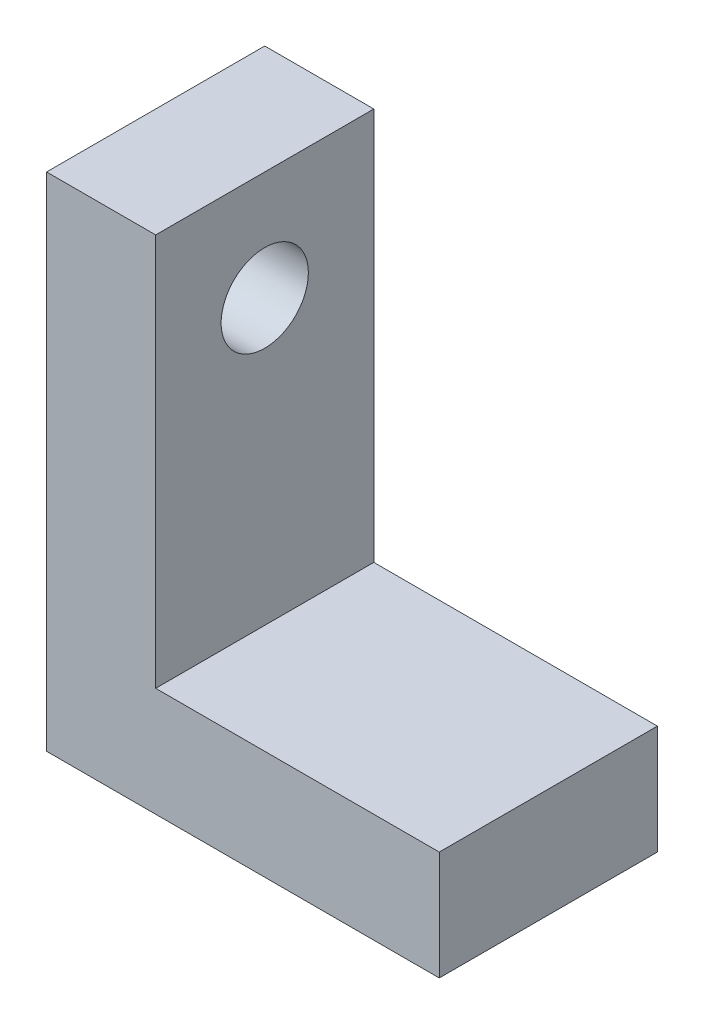
ISO-10303-21;
HEADER;
FILE_DESCRIPTION(('STEP AP214'),'2;1');
FILE_NAME('part.step','',(''),(''),'','','');
FILE_SCHEMA(('AUTOMOTIVE_DESIGN { 1 0 10303 214 1 1 1 1 }'));
ENDSEC;
DATA;
#1=APPLICATION_CONTEXT('core data for automotive mechanical design processes');
#2=APPLICATION_PROTOCOL_DEFINITION('international standard','automotive_design',2000,#1);
#3=PRODUCT_CONTEXT('',#1,'mechanical');
#4=PRODUCT('Part','Part','',(#3));
#5=PRODUCT_RELATED_PRODUCT_CATEGORY('part','',(#4));
#6=PRODUCT_DEFINITION_FORMATION('','',#4);
#7=PRODUCT_DEFINITION_CONTEXT('part definition',#1,'design');
#8=PRODUCT_DEFINITION('design','',#6,#7);
#9=PRODUCT_DEFINITION_SHAPE('','',#8);
#10=(LENGTH_UNIT() NAMED_UNIT(*) SI_UNIT(.MILLI.,.METRE.));
#11=(NAMED_UNIT(*) PLANE_ANGLE_UNIT() SI_UNIT($,.RADIAN.));
#12=(NAMED_UNIT(*) SI_UNIT($,.STERADIAN.) SOLID_ANGLE_UNIT());
#13=UNCERTAINTY_MEASURE_WITH_UNIT(LENGTH_MEASURE(1.E-05),#10,'distance_accuracy_value','');
#14=(GEOMETRIC_REPRESENTATION_CONTEXT(3) GLOBAL_UNCERTAINTY_ASSIGNED_CONTEXT((#13)) GLOBAL_UNIT_ASSIGNED_CONTEXT((#10,
#11,#12)) REPRESENTATION_CONTEXT('',''));
#15=CARTESIAN_POINT('',(0.,0.,0.));
#16=DIRECTION('',(0.,0.,1.));
#17=DIRECTION('',(1.,0.,0.));
#18=AXIS2_PLACEMENT_3D('',#15,#16,#17);
#19=CARTESIAN_POINT('',(18.,0.,5.));
#20=DIRECTION('',(0.,1.,0.));
#21=DIRECTION('',(-1.,0.,0.));
#22=AXIS2_PLACEMENT_3D('',#19,#20,#21);
#23=PLANE('',#22);
#24=DIRECTION('',(1.,0.,0.));
#25=VECTOR('',#24,1.);
#26=CARTESIAN_POINT('',(18.,0.,-5.));
#27=LINE('',#26,#25);
#28=CARTESIAN_POINT('',(0.,0.,-5.));
#29=VERTEX_POINT('',#28);
#30=CARTESIAN_POINT('',(18.,0.,-5.));
#31=VERTEX_POINT('',#30);
#32=EDGE_CURVE('E133',#29,#31,#27,.T.);
#33=ORIENTED_EDGE('',*,*,#32,.T.);
#34=DIRECTION('',(0.,0.,-1.));
#35=VECTOR('',#34,1.);
#36=CARTESIAN_POINT('',(18.,0.,5.));
#37=LINE('',#36,#35);
#38=CARTESIAN_POINT('',(18.,0.,5.));
#39=VERTEX_POINT('',#38);
#40=EDGE_CURVE('E11',#39,#31,#37,.T.);
#41=ORIENTED_EDGE('',*,*,#40,.F.);
#42=DIRECTION('',(1.,0.,0.));
#43=VECTOR('',#42,1.);
#44=CARTESIAN_POINT('',(18.,0.,5.));
#45=LINE('',#44,#43);
#46=CARTESIAN_POINT('',(0.,0.,5.));
#47=VERTEX_POINT('',#46);
#48=EDGE_CURVE('E151',#47,#39,#45,.T.);
#49=ORIENTED_EDGE('',*,*,#48,.F.);
#50=DIRECTION('',(0.,0.,-1.));
#51=VECTOR('',#50,1.);
#52=CARTESIAN_POINT('',(0.,0.,5.));
#53=LINE('',#52,#51);
#54=EDGE_CURVE('E128',#47,#29,#53,.T.);
#55=ORIENTED_EDGE('',*,*,#54,.T.);
#56=EDGE_LOOP('',(#33,#41,#49,#55));
#57=FACE_BOUND('',#56,.T.);
#58=ADVANCED_FACE('F44',(#57),#23,.F.);
#59=CARTESIAN_POINT('',(18.,5.,5.));
#60=DIRECTION('',(-1.,0.,0.));
#61=DIRECTION('',(0.,0.,1.));
#62=AXIS2_PLACEMENT_3D('',#59,#60,#61);
#63=PLANE('',#62);
#64=DIRECTION('',(0.,1.,0.));
#65=VECTOR('',#64,1.);
#66=CARTESIAN_POINT('',(18.,5.,-5.));
#67=LINE('',#66,#65);
#68=CARTESIAN_POINT('',(18.,5.,-5.));
#69=VERTEX_POINT('',#68);
#70=EDGE_CURVE('E139',#31,#69,#67,.T.);
#71=ORIENTED_EDGE('',*,*,#70,.T.);
#72=DIRECTION('',(0.,0.,-1.));
#73=VECTOR('',#72,1.);
#74=CARTESIAN_POINT('',(18.,5.,5.));
#75=LINE('',#74,#73);
#76=CARTESIAN_POINT('',(18.,5.,5.));
#77=VERTEX_POINT('',#76);
#78=EDGE_CURVE('E53',#77,#69,#75,.T.);
#79=ORIENTED_EDGE('',*,*,#78,.F.);
#80=DIRECTION('',(0.,1.,0.));
#81=VECTOR('',#80,1.);
#82=CARTESIAN_POINT('',(18.,5.,5.));
#83=LINE('',#82,#81);
#84=EDGE_CURVE('E97',#39,#77,#83,.T.);
#85=ORIENTED_EDGE('',*,*,#84,.F.);
#86=ORIENTED_EDGE('',*,*,#40,.T.);
#87=EDGE_LOOP('',(#71,#79,#85,#86));
#88=FACE_BOUND('',#87,.T.);
#89=ADVANCED_FACE('F181',(#88),#63,.F.);
#90=CARTESIAN_POINT('',(5.,5.,5.));
#91=DIRECTION('',(0.,-1.,0.));
#92=DIRECTION('',(0.,0.,-1.));
#93=AXIS2_PLACEMENT_3D('',#90,#91,#92);
#94=PLANE('',#93);
#95=DIRECTION('',(-1.,0.,0.));
#96=VECTOR('',#95,1.);
#97=CARTESIAN_POINT('',(5.,5.,-5.));
#98=LINE('',#97,#96);
#99=CARTESIAN_POINT('',(5.,5.,-5.));
#100=VERTEX_POINT('',#99);
#101=EDGE_CURVE('E142',#69,#100,#98,.T.);
#102=ORIENTED_EDGE('',*,*,#101,.T.);
#103=DIRECTION('',(0.,0.,-1.));
#104=VECTOR('',#103,1.);
#105=CARTESIAN_POINT('',(5.,5.,5.));
#106=LINE('',#105,#104);
#107=CARTESIAN_POINT('',(5.,5.,5.));
#108=VERTEX_POINT('',#107);
#109=EDGE_CURVE('E124',#108,#100,#106,.T.);
#110=ORIENTED_EDGE('',*,*,#109,.F.);
#111=DIRECTION('',(-1.,0.,0.));
#112=VECTOR('',#111,1.);
#113=CARTESIAN_POINT('',(5.,5.,5.));
#114=LINE('',#113,#112);
#115=EDGE_CURVE('E115',#77,#108,#114,.T.);
#116=ORIENTED_EDGE('',*,*,#115,.F.);
#117=ORIENTED_EDGE('',*,*,#78,.T.);
#118=EDGE_LOOP('',(#102,#110,#116,#117));
#119=FACE_BOUND('',#118,.T.);
#120=ADVANCED_FACE('F161',(#119),#94,.F.);
#121=CARTESIAN_POINT('',(5.,23.,5.));
#122=DIRECTION('',(-1.,0.,0.));
#123=DIRECTION('',(0.,-1.,0.));
#124=AXIS2_PLACEMENT_3D('',#121,#122,#123);
#125=PLANE('',#124);
#126=CARTESIAN_POINT('',(5.,18.,0.));
#127=DIRECTION('',(1.,0.,0.));
#128=DIRECTION('',(0.,0.,-1.));
#129=AXIS2_PLACEMENT_3D('',#126,#127,#128);
#130=CIRCLE('',#129,2.);
#131=CARTESIAN_POINT('',(5.,18.,-2.));
#132=VERTEX_POINT('',#131);
#133=EDGE_CURVE('E196',#132,#132,#130,.T.);
#134=ORIENTED_EDGE('',*,*,#133,.F.);
#135=EDGE_LOOP('',(#134));
#136=FACE_BOUND('',#135,.T.);
#137=DIRECTION('',(0.,1.,0.));
#138=VECTOR('',#137,1.);
#139=CARTESIAN_POINT('',(5.,23.,-5.));
#140=LINE('',#139,#138);
#141=CARTESIAN_POINT('',(5.,23.,-5.));
#142=VERTEX_POINT('',#141);
#143=EDGE_CURVE('E121',#100,#142,#140,.T.);
#144=ORIENTED_EDGE('',*,*,#143,.T.);
#145=DIRECTION('',(0.,0.,-1.));
#146=VECTOR('',#145,1.);
#147=CARTESIAN_POINT('',(5.,23.,5.));
#148=LINE('',#147,#146);
#149=CARTESIAN_POINT('',(5.,23.,5.));
#150=VERTEX_POINT('',#149);
#151=EDGE_CURVE('E117',#150,#142,#148,.T.);
#152=ORIENTED_EDGE('',*,*,#151,.F.);
#153=DIRECTION('',(0.,1.,0.));
#154=VECTOR('',#153,1.);
#155=CARTESIAN_POINT('',(5.,23.,5.));
#156=LINE('',#155,#154);
#157=EDGE_CURVE('E106',#108,#150,#156,.T.);
#158=ORIENTED_EDGE('',*,*,#157,.F.);
#159=ORIENTED_EDGE('',*,*,#109,.T.);
#160=EDGE_LOOP('',(#144,#152,#158,#159));
#161=FACE_BOUND('',#160,.T.);
#162=ADVANCED_FACE('F118',(#136,#161),#125,.F.);
#163=CARTESIAN_POINT('',(0.,23.,5.));
#164=DIRECTION('',(0.,-1.,0.));
#165=DIRECTION('',(0.,0.,-1.));
#166=AXIS2_PLACEMENT_3D('',#163,#164,#165);
#167=PLANE('',#166);
#168=DIRECTION('',(-1.,0.,0.));
#169=VECTOR('',#168,1.);
#170=CARTESIAN_POINT('',(0.,23.,-5.));
#171=LINE('',#170,#169);
#172=CARTESIAN_POINT('',(0.,23.,-5.));
#173=VERTEX_POINT('',#172);
#174=EDGE_CURVE('E85',#142,#173,#171,.T.);
#175=ORIENTED_EDGE('',*,*,#174,.T.);
#176=DIRECTION('',(0.,0.,-1.));
#177=VECTOR('',#176,1.);
#178=CARTESIAN_POINT('',(0.,23.,5.));
#179=LINE('',#178,#177);
#180=CARTESIAN_POINT('',(0.,23.,5.));
#181=VERTEX_POINT('',#180);
#182=EDGE_CURVE('E123',#181,#173,#179,.T.);
#183=ORIENTED_EDGE('',*,*,#182,.F.);
#184=DIRECTION('',(-1.,0.,0.));
#185=VECTOR('',#184,1.);
#186=CARTESIAN_POINT('',(0.,23.,5.));
#187=LINE('',#186,#185);
#188=EDGE_CURVE('E109',#150,#181,#187,.T.);
#189=ORIENTED_EDGE('',*,*,#188,.F.);
#190=ORIENTED_EDGE('',*,*,#151,.T.);
#191=EDGE_LOOP('',(#175,#183,#189,#190));
#192=FACE_BOUND('',#191,.T.);
#193=ADVANCED_FACE('F127',(#192),#167,.F.);
#194=CARTESIAN_POINT('',(0.,0.,5.));
#195=DIRECTION('',(1.,0.,0.));
#196=DIRECTION('',(0.,0.,-1.));
#197=AXIS2_PLACEMENT_3D('',#194,#195,#196);
#198=PLANE('',#197);
#199=CARTESIAN_POINT('',(0.,18.,0.));
#200=DIRECTION('',(1.,0.,0.));
#201=DIRECTION('',(0.,0.,-1.));
#202=AXIS2_PLACEMENT_3D('',#199,#200,#201);
#203=CIRCLE('',#202,2.);
#204=CARTESIAN_POINT('',(0.,18.,-2.));
#205=VERTEX_POINT('',#204);
#206=EDGE_CURVE('E138',#205,#205,#203,.T.);
#207=ORIENTED_EDGE('',*,*,#206,.T.);
#208=EDGE_LOOP('',(#207));
#209=FACE_BOUND('',#208,.T.);
#210=DIRECTION('',(0.,-1.,0.));
#211=VECTOR('',#210,1.);
#212=CARTESIAN_POINT('',(0.,0.,-5.));
#213=LINE('',#212,#211);
#214=EDGE_CURVE('E93',#173,#29,#213,.T.);
#215=ORIENTED_EDGE('',*,*,#214,.T.);
#216=ORIENTED_EDGE('',*,*,#54,.F.);
#217=DIRECTION('',(0.,-1.,0.));
#218=VECTOR('',#217,1.);
#219=CARTESIAN_POINT('',(0.,0.,5.));
#220=LINE('',#219,#218);
#221=EDGE_CURVE('E65',#181,#47,#220,.T.);
#222=ORIENTED_EDGE('',*,*,#221,.F.);
#223=ORIENTED_EDGE('',*,*,#182,.T.);
#224=EDGE_LOOP('',(#215,#216,#222,#223));
#225=FACE_BOUND('',#224,.T.);
#226=ADVANCED_FACE('F169',(#209,#225),#198,.F.);
#227=CARTESIAN_POINT('',(0.,0.,5.));
#228=DIRECTION('',(0.,0.,-1.));
#229=DIRECTION('',(-1.,0.,0.));
#230=AXIS2_PLACEMENT_3D('',#227,#228,#229);
#231=PLANE('',#230);
#232=ORIENTED_EDGE('',*,*,#48,.T.);
#233=ORIENTED_EDGE('',*,*,#84,.T.);
#234=ORIENTED_EDGE('',*,*,#115,.T.);
#235=ORIENTED_EDGE('',*,*,#157,.T.);
#236=ORIENTED_EDGE('',*,*,#188,.T.);
#237=ORIENTED_EDGE('',*,*,#221,.T.);
#238=EDGE_LOOP('',(#232,#233,#234,#235,#236,#237));
#239=FACE_BOUND('',#238,.T.);
#240=ADVANCED_FACE('F107',(#239),#231,.F.);
#241=CARTESIAN_POINT('',(0.,0.,-5.));
#242=DIRECTION('',(0.,0.,-1.));
#243=DIRECTION('',(-1.,0.,0.));
#244=AXIS2_PLACEMENT_3D('',#241,#242,#243);
#245=PLANE('',#244);
#246=ORIENTED_EDGE('',*,*,#32,.F.);
#247=ORIENTED_EDGE('',*,*,#214,.F.);
#248=ORIENTED_EDGE('',*,*,#174,.F.);
#249=ORIENTED_EDGE('',*,*,#143,.F.);
#250=ORIENTED_EDGE('',*,*,#101,.F.);
#251=ORIENTED_EDGE('',*,*,#70,.F.);
#252=EDGE_LOOP('',(#246,#247,#248,#249,#250,#251));
#253=FACE_BOUND('',#252,.T.);
#254=ADVANCED_FACE('F163',(#253),#245,.T.);
#255=CARTESIAN_POINT('',(0.,18.,0.));
#256=DIRECTION('',(1.,0.,0.));
#257=DIRECTION('',(0.,0.,-1.));
#258=AXIS2_PLACEMENT_3D('',#255,#256,#257);
#259=CYLINDRICAL_SURFACE('',#258,2.);
#260=ORIENTED_EDGE('',*,*,#206,.F.);
#261=EDGE_LOOP('',(#260));
#262=FACE_BOUND('',#261,.T.);
#263=ORIENTED_EDGE('',*,*,#133,.T.);
#264=EDGE_LOOP('',(#263));
#265=FACE_BOUND('',#264,.T.);
#266=ADVANCED_FACE('F211',(#262,#265),#259,.F.);
#267=CLOSED_SHELL('',(#58,#89,#120,#162,#193,#226,#240,#254,#266));
#268=MANIFOLD_SOLID_BREP('B2',#267);
#269=ADVANCED_BREP_SHAPE_REPRESENTATION('',(#18,#268),#14);
#270=SHAPE_DEFINITION_REPRESENTATION(#9,#269);
ENDSEC;
END-ISO-10303-21;
